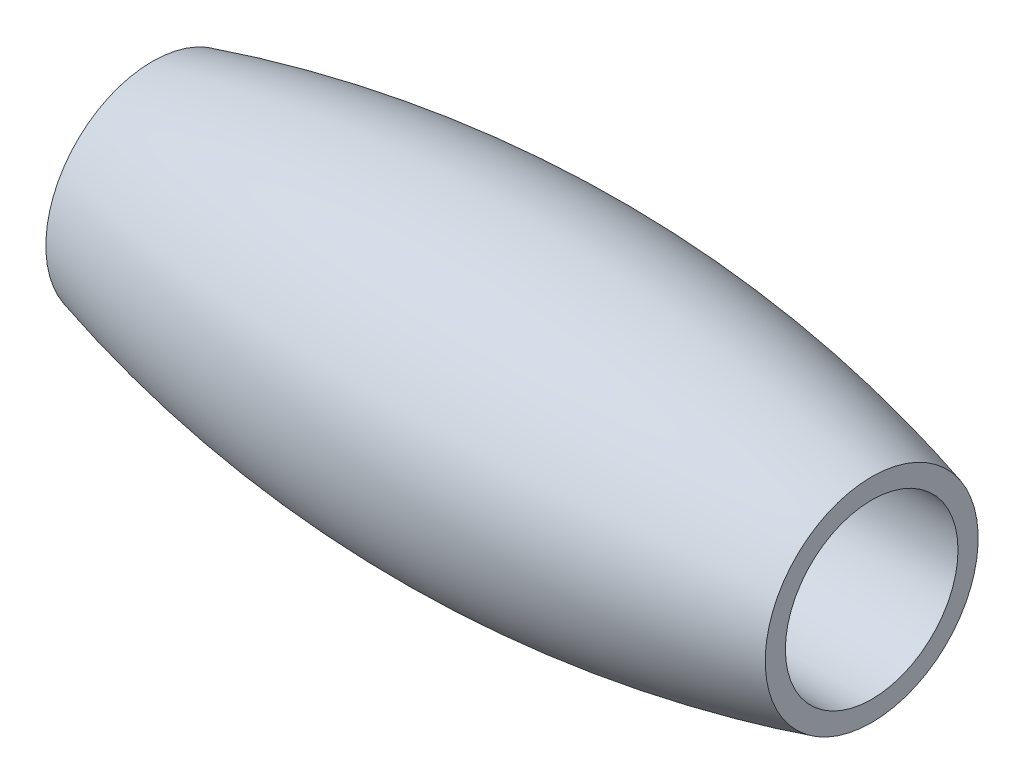
ISO-10303-21;
HEADER;
FILE_DESCRIPTION(('STEP AP214'),'2;1');
FILE_NAME('part.step','',(''),(''),'','','');
FILE_SCHEMA(('AUTOMOTIVE_DESIGN { 1 0 10303 214 1 1 1 1 }'));
ENDSEC;
DATA;
#1=APPLICATION_CONTEXT('core data for automotive mechanical design processes');
#2=APPLICATION_PROTOCOL_DEFINITION('international standard','automotive_design',2000,#1);
#3=PRODUCT_CONTEXT('',#1,'mechanical');
#4=PRODUCT('Part','Part','',(#3));
#5=PRODUCT_RELATED_PRODUCT_CATEGORY('part','',(#4));
#6=PRODUCT_DEFINITION_FORMATION('','',#4);
#7=PRODUCT_DEFINITION_CONTEXT('part definition',#1,'design');
#8=PRODUCT_DEFINITION('design','',#6,#7);
#9=PRODUCT_DEFINITION_SHAPE('','',#8);
#10=(LENGTH_UNIT() NAMED_UNIT(*) SI_UNIT(.MILLI.,.METRE.));
#11=(NAMED_UNIT(*) PLANE_ANGLE_UNIT() SI_UNIT($,.RADIAN.));
#12=(NAMED_UNIT(*) SI_UNIT($,.STERADIAN.) SOLID_ANGLE_UNIT());
#13=UNCERTAINTY_MEASURE_WITH_UNIT(LENGTH_MEASURE(1.E-05),#10,'distance_accuracy_value','');
#14=(GEOMETRIC_REPRESENTATION_CONTEXT(3) GLOBAL_UNCERTAINTY_ASSIGNED_CONTEXT((#13)) GLOBAL_UNIT_ASSIGNED_CONTEXT((#10,
#11,#12)) REPRESENTATION_CONTEXT('',''));
#15=CARTESIAN_POINT('',(0.,0.,0.));
#16=DIRECTION('',(0.,0.,1.));
#17=DIRECTION('',(1.,0.,0.));
#18=AXIS2_PLACEMENT_3D('',#15,#16,#17);
#19=CARTESIAN_POINT('',(0.,0.,0.));
#20=DIRECTION('',(-1.,0.,0.));
#21=DIRECTION('',(0.,-1.,0.));
#22=AXIS2_PLACEMENT_3D('',#19,#20,#21);
#23=DEGENERATE_TOROIDAL_SURFACE('',#22,62.1088235294118,70.2088235294118,.F.);
#24=CARTESIAN_POINT('',(18.75,0.,0.));
#25=DIRECTION('',(-1.,0.,0.));
#26=DIRECTION('',(0.,-1.,0.));
#27=AXIS2_PLACEMENT_3D('',#24,#25,#26);
#28=CIRCLE('',#27,5.55);
#29=CARTESIAN_POINT('',(18.75,-5.55,0.));
#30=VERTEX_POINT('',#29);
#31=EDGE_CURVE('E10',#30,#30,#28,.T.);
#32=ORIENTED_EDGE('',*,*,#31,.T.);
#33=EDGE_LOOP('',(#32));
#34=FACE_BOUND('',#33,.T.);
#35=CARTESIAN_POINT('',(-18.75,0.,0.));
#36=DIRECTION('',(-1.,0.,0.));
#37=DIRECTION('',(0.,-1.,0.));
#38=AXIS2_PLACEMENT_3D('',#35,#36,#37);
#39=CIRCLE('',#38,5.55);
#40=CARTESIAN_POINT('',(-18.75,-5.54999999999999,0.));
#41=VERTEX_POINT('',#40);
#42=EDGE_CURVE('E51',#41,#41,#39,.T.);
#43=ORIENTED_EDGE('',*,*,#42,.F.);
#44=EDGE_LOOP('',(#43));
#45=FACE_BOUND('',#44,.T.);
#46=ADVANCED_FACE('F37',(#34,#45),#23,.F.);
#47=CARTESIAN_POINT('',(18.75,5.55,0.));
#48=DIRECTION('',(1.,0.,0.));
#49=DIRECTION('',(0.,1.,0.));
#50=AXIS2_PLACEMENT_3D('',#47,#48,#49);
#51=PLANE('',#50);
#52=CARTESIAN_POINT('',(18.75,0.,0.));
#53=DIRECTION('',(-1.,0.,0.));
#54=DIRECTION('',(0.,-1.,0.));
#55=AXIS2_PLACEMENT_3D('',#52,#53,#54);
#56=CIRCLE('',#55,4.5);
#57=CARTESIAN_POINT('',(18.75,-4.5,0.));
#58=VERTEX_POINT('',#57);
#59=EDGE_CURVE('E43',#58,#58,#56,.T.);
#60=ORIENTED_EDGE('',*,*,#59,.T.);
#61=EDGE_LOOP('',(#60));
#62=FACE_BOUND('',#61,.T.);
#63=ORIENTED_EDGE('',*,*,#31,.F.);
#64=EDGE_LOOP('',(#63));
#65=FACE_BOUND('',#64,.T.);
#66=ADVANCED_FACE('F61',(#62,#65),#51,.T.);
#67=CARTESIAN_POINT('',(18.75,0.,0.));
#68=DIRECTION('',(-1.,0.,0.));
#69=DIRECTION('',(0.,-1.,0.));
#70=AXIS2_PLACEMENT_3D('',#67,#68,#69);
#71=CYLINDRICAL_SURFACE('',#70,4.5);
#72=CARTESIAN_POINT('',(-18.75,0.,0.));
#73=DIRECTION('',(-1.,0.,0.));
#74=DIRECTION('',(0.,-1.,0.));
#75=AXIS2_PLACEMENT_3D('',#72,#73,#74);
#76=CIRCLE('',#75,4.5);
#77=CARTESIAN_POINT('',(-18.75,-4.49999999999999,0.));
#78=VERTEX_POINT('',#77);
#79=EDGE_CURVE('E47',#78,#78,#76,.T.);
#80=ORIENTED_EDGE('',*,*,#79,.T.);
#81=EDGE_LOOP('',(#80));
#82=FACE_BOUND('',#81,.T.);
#83=ORIENTED_EDGE('',*,*,#59,.F.);
#84=EDGE_LOOP('',(#83));
#85=FACE_BOUND('',#84,.T.);
#86=ADVANCED_FACE('F65',(#82,#85),#71,.F.);
#87=CARTESIAN_POINT('',(-18.75,4.50000000000001,0.));
#88=DIRECTION('',(-1.,0.,0.));
#89=DIRECTION('',(0.,-1.,0.));
#90=AXIS2_PLACEMENT_3D('',#87,#88,#89);
#91=PLANE('',#90);
#92=ORIENTED_EDGE('',*,*,#42,.T.);
#93=EDGE_LOOP('',(#92));
#94=FACE_BOUND('',#93,.T.);
#95=ORIENTED_EDGE('',*,*,#79,.F.);
#96=EDGE_LOOP('',(#95));
#97=FACE_BOUND('',#96,.T.);
#98=ADVANCED_FACE('F57',(#94,#97),#91,.T.);
#99=CLOSED_SHELL('',(#46,#66,#86,#98));
#100=MANIFOLD_SOLID_BREP('B2',#99);
#101=ADVANCED_BREP_SHAPE_REPRESENTATION('',(#18,#100),#14);
#102=SHAPE_DEFINITION_REPRESENTATION(#9,#101);
ENDSEC;
END-ISO-10303-21;
